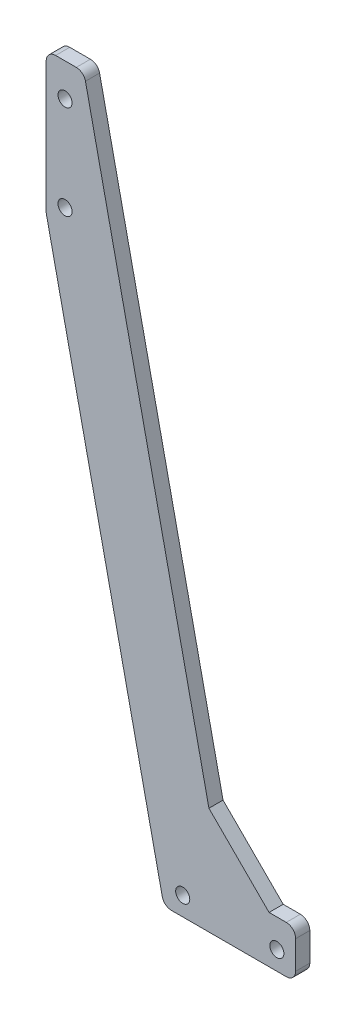
ISO-10303-21;
HEADER;
FILE_DESCRIPTION(('STEP AP214'),'2;1');
FILE_NAME('part.step','',(''),(''),'','','');
FILE_SCHEMA(('AUTOMOTIVE_DESIGN { 1 0 10303 214 1 1 1 1 }'));
ENDSEC;
DATA;
#1=APPLICATION_CONTEXT('core data for automotive mechanical design processes');
#2=APPLICATION_PROTOCOL_DEFINITION('international standard','automotive_design',2000,#1);
#3=PRODUCT_CONTEXT('',#1,'mechanical');
#4=PRODUCT('Part','Part','',(#3));
#5=PRODUCT_RELATED_PRODUCT_CATEGORY('part','',(#4));
#6=PRODUCT_DEFINITION_FORMATION('','',#4);
#7=PRODUCT_DEFINITION_CONTEXT('part definition',#1,'design');
#8=PRODUCT_DEFINITION('design','',#6,#7);
#9=PRODUCT_DEFINITION_SHAPE('','',#8);
#10=(LENGTH_UNIT() NAMED_UNIT(*) SI_UNIT(.MILLI.,.METRE.));
#11=(NAMED_UNIT(*) PLANE_ANGLE_UNIT() SI_UNIT($,.RADIAN.));
#12=(NAMED_UNIT(*) SI_UNIT($,.STERADIAN.) SOLID_ANGLE_UNIT());
#13=UNCERTAINTY_MEASURE_WITH_UNIT(LENGTH_MEASURE(1.E-05),#10,'distance_accuracy_value','');
#14=(GEOMETRIC_REPRESENTATION_CONTEXT(3) GLOBAL_UNCERTAINTY_ASSIGNED_CONTEXT((#13)) GLOBAL_UNIT_ASSIGNED_CONTEXT((#10,
#11,#12)) REPRESENTATION_CONTEXT('',''));
#15=CARTESIAN_POINT('',(0.,0.,0.));
#16=DIRECTION('',(0.,0.,1.));
#17=DIRECTION('',(1.,0.,0.));
#18=AXIS2_PLACEMENT_3D('',#15,#16,#17);
#19=CARTESIAN_POINT('',(0.,0.,3.));
#20=DIRECTION('',(0.,0.,1.));
#21=DIRECTION('',(1.,0.,0.));
#22=AXIS2_PLACEMENT_3D('',#19,#20,#21);
#23=PLANE('',#22);
#24=CARTESIAN_POINT('',(49.,4.,3.));
#25=DIRECTION('',(0.,0.,1.));
#26=DIRECTION('',(1.,0.,0.));
#27=AXIS2_PLACEMENT_3D('',#24,#25,#26);
#28=CIRCLE('',#27,1.5);
#29=CARTESIAN_POINT('',(50.5,4.,3.));
#30=VERTEX_POINT('',#29);
#31=EDGE_CURVE('E328',#30,#30,#28,.T.);
#32=ORIENTED_EDGE('',*,*,#31,.F.);
#33=EDGE_LOOP('',(#32));
#34=FACE_BOUND('',#33,.T.);
#35=CARTESIAN_POINT('',(4.,118.,3.));
#36=DIRECTION('',(0.,0.,1.));
#37=DIRECTION('',(1.,0.,0.));
#38=AXIS2_PLACEMENT_3D('',#35,#36,#37);
#39=CIRCLE('',#38,1.5);
#40=CARTESIAN_POINT('',(5.5,118.,3.));
#41=VERTEX_POINT('',#40);
#42=EDGE_CURVE('E270',#41,#41,#39,.T.);
#43=ORIENTED_EDGE('',*,*,#42,.F.);
#44=EDGE_LOOP('',(#43));
#45=FACE_BOUND('',#44,.T.);
#46=DIRECTION('',(0.,-1.,0.));
#47=VECTOR('',#46,1.);
#48=CARTESIAN_POINT('',(0.,145.,3.));
#49=LINE('',#48,#47);
#50=CARTESIAN_POINT('',(0.,143.,3.));
#51=VERTEX_POINT('',#50);
#52=CARTESIAN_POINT('',(0.,115.214881836752,3.));
#53=VERTEX_POINT('',#52);
#54=EDGE_CURVE('E178',#51,#53,#49,.T.);
#55=ORIENTED_EDGE('',*,*,#54,.T.);
#56=CARTESIAN_POINT('',(2.,115.214881836752,3.));
#57=DIRECTION('',(0.,0.,1.));
#58=DIRECTION('',(1.,0.,0.));
#59=AXIS2_PLACEMENT_3D('',#56,#57,#58);
#60=CIRCLE('',#59,2.);
#61=CARTESIAN_POINT('',(0.0456472721544016,114.79002254809,3.));
#62=VERTEX_POINT('',#61);
#63=EDGE_CURVE('E233',#53,#62,#60,.T.);
#64=ORIENTED_EDGE('',*,*,#63,.T.);
#65=DIRECTION('',(0.212429644331044,-0.977176363922801,0.));
#66=VECTOR('',#65,1.);
#67=CARTESIAN_POINT('',(0.,115.,3.));
#68=LINE('',#67,#66);
#69=CARTESIAN_POINT('',(24.6575781062309,1.57514071133794,3.));
#70=VERTEX_POINT('',#69);
#71=EDGE_CURVE('E313',#62,#70,#68,.T.);
#72=ORIENTED_EDGE('',*,*,#71,.T.);
#73=CARTESIAN_POINT('',(26.6119308340765,2.,3.));
#74=DIRECTION('',(0.,0.,1.));
#75=DIRECTION('',(1.,0.,0.));
#76=AXIS2_PLACEMENT_3D('',#73,#74,#75);
#77=CIRCLE('',#76,2.);
#78=CARTESIAN_POINT('',(26.6119308340765,0.,3.));
#79=VERTEX_POINT('',#78);
#80=EDGE_CURVE('E230',#70,#79,#77,.T.);
#81=ORIENTED_EDGE('',*,*,#80,.T.);
#82=DIRECTION('',(1.,0.,0.));
#83=VECTOR('',#82,1.);
#84=CARTESIAN_POINT('',(25.,0.,3.));
#85=LINE('',#84,#83);
#86=CARTESIAN_POINT('',(51.,0.,3.));
#87=VERTEX_POINT('',#86);
#88=EDGE_CURVE('E307',#79,#87,#85,.T.);
#89=ORIENTED_EDGE('',*,*,#88,.T.);
#90=CARTESIAN_POINT('',(51.,2.,3.));
#91=DIRECTION('',(0.,0.,1.));
#92=DIRECTION('',(1.,0.,0.));
#93=AXIS2_PLACEMENT_3D('',#90,#91,#92);
#94=CIRCLE('',#93,2.);
#95=CARTESIAN_POINT('',(53.,2.,3.));
#96=VERTEX_POINT('',#95);
#97=EDGE_CURVE('E227',#87,#96,#94,.T.);
#98=ORIENTED_EDGE('',*,*,#97,.T.);
#99=DIRECTION('',(0.,1.,0.));
#100=VECTOR('',#99,1.);
#101=CARTESIAN_POINT('',(53.,10.,3.));
#102=LINE('',#101,#100);
#103=CARTESIAN_POINT('',(53.,8.,3.));
#104=VERTEX_POINT('',#103);
#105=EDGE_CURVE('E304',#96,#104,#102,.T.);
#106=ORIENTED_EDGE('',*,*,#105,.T.);
#107=CARTESIAN_POINT('',(51.,8.,3.));
#108=DIRECTION('',(0.,0.,1.));
#109=DIRECTION('',(1.,0.,0.));
#110=AXIS2_PLACEMENT_3D('',#107,#108,#109);
#111=CIRCLE('',#110,2.);
#112=CARTESIAN_POINT('',(51.,10.,3.));
#113=VERTEX_POINT('',#112);
#114=EDGE_CURVE('E66',#104,#113,#111,.T.);
#115=ORIENTED_EDGE('',*,*,#114,.T.);
#116=DIRECTION('',(-1.,0.,0.));
#117=VECTOR('',#116,1.);
#118=CARTESIAN_POINT('',(37.3478260869565,10.,3.));
#119=LINE('',#118,#117);
#120=CARTESIAN_POINT('',(47.3478260869565,10.,3.));
#121=VERTEX_POINT('',#120);
#122=EDGE_CURVE('E302',#113,#121,#119,.T.);
#123=ORIENTED_EDGE('',*,*,#122,.T.);
#124=DIRECTION('',(0.707106781186544,-0.707106781186551,0.));
#125=VECTOR('',#124,1.);
#126=CARTESIAN_POINT('',(34.5700483091787,22.7777777777779,3.));
#127=LINE('',#126,#125);
#128=CARTESIAN_POINT('',(34.5700483091787,22.7777777777779,3.));
#129=VERTEX_POINT('',#128);
#130=EDGE_CURVE('E159',#121,#129,#127,.F.);
#131=ORIENTED_EDGE('',*,*,#130,.T.);
#132=DIRECTION('',(-0.212429644331044,0.977176363922801,0.));
#133=VECTOR('',#132,1.);
#134=CARTESIAN_POINT('',(8.,145.,3.));
#135=LINE('',#134,#133);
#136=CARTESIAN_POINT('',(8.34242189376911,143.424859288662,3.));
#137=VERTEX_POINT('',#136);
#138=EDGE_CURVE('E163',#129,#137,#135,.T.);
#139=ORIENTED_EDGE('',*,*,#138,.T.);
#140=CARTESIAN_POINT('',(6.38806916592351,143.,3.));
#141=DIRECTION('',(0.,0.,1.));
#142=DIRECTION('',(1.,0.,0.));
#143=AXIS2_PLACEMENT_3D('',#140,#141,#142);
#144=CIRCLE('',#143,2.);
#145=CARTESIAN_POINT('',(6.38806916592351,145.,3.));
#146=VERTEX_POINT('',#145);
#147=EDGE_CURVE('E222',#137,#146,#144,.T.);
#148=ORIENTED_EDGE('',*,*,#147,.T.);
#149=DIRECTION('',(-1.,0.,0.));
#150=VECTOR('',#149,1.);
#151=CARTESIAN_POINT('',(8.,145.,3.));
#152=LINE('',#151,#150);
#153=CARTESIAN_POINT('',(2.,145.,3.));
#154=VERTEX_POINT('',#153);
#155=EDGE_CURVE('E172',#146,#154,#152,.T.);
#156=ORIENTED_EDGE('',*,*,#155,.T.);
#157=CARTESIAN_POINT('',(2.,143.,3.));
#158=DIRECTION('',(0.,0.,1.));
#159=DIRECTION('',(1.,0.,0.));
#160=AXIS2_PLACEMENT_3D('',#157,#158,#159);
#161=CIRCLE('',#160,2.);
#162=EDGE_CURVE('E219',#154,#51,#161,.T.);
#163=ORIENTED_EDGE('',*,*,#162,.T.);
#164=EDGE_LOOP('',(#55,#64,#72,#81,#89,#98,#106,#115,#123,#131,#139,#148,#156,#163));
#165=FACE_BOUND('',#164,.T.);
#166=CARTESIAN_POINT('',(4.,138.,3.));
#167=DIRECTION('',(0.,0.,1.));
#168=DIRECTION('',(1.,0.,0.));
#169=AXIS2_PLACEMENT_3D('',#166,#167,#168);
#170=CIRCLE('',#169,1.5);
#171=CARTESIAN_POINT('',(5.5,138.,3.));
#172=VERTEX_POINT('',#171);
#173=EDGE_CURVE('E322',#172,#172,#170,.T.);
#174=ORIENTED_EDGE('',*,*,#173,.F.);
#175=EDGE_LOOP('',(#174));
#176=FACE_BOUND('',#175,.T.);
#177=CARTESIAN_POINT('',(29.,4.,3.));
#178=DIRECTION('',(0.,0.,1.));
#179=DIRECTION('',(1.,0.,0.));
#180=AXIS2_PLACEMENT_3D('',#177,#178,#179);
#181=CIRCLE('',#180,1.50000000000001);
#182=CARTESIAN_POINT('',(30.5,4.,3.));
#183=VERTEX_POINT('',#182);
#184=EDGE_CURVE('E336',#183,#183,#181,.T.);
#185=ORIENTED_EDGE('',*,*,#184,.F.);
#186=EDGE_LOOP('',(#185));
#187=FACE_BOUND('',#186,.T.);
#188=ADVANCED_FACE('F44',(#34,#45,#165,#176,#187),#23,.T.);
#189=CARTESIAN_POINT('',(0.,0.,0.));
#190=DIRECTION('',(0.,0.,1.));
#191=DIRECTION('',(1.,0.,0.));
#192=AXIS2_PLACEMENT_3D('',#189,#190,#191);
#193=PLANE('',#192);
#194=DIRECTION('',(0.212429644331044,-0.977176363922801,0.));
#195=VECTOR('',#194,1.);
#196=CARTESIAN_POINT('',(0.,115.,0.));
#197=LINE('',#196,#195);
#198=CARTESIAN_POINT('',(0.0456472721544016,114.79002254809,0.));
#199=VERTEX_POINT('',#198);
#200=CARTESIAN_POINT('',(24.6575781062309,1.57514071133794,0.));
#201=VERTEX_POINT('',#200);
#202=EDGE_CURVE('E275',#199,#201,#197,.T.);
#203=ORIENTED_EDGE('',*,*,#202,.F.);
#204=CARTESIAN_POINT('',(2.,115.214881836752,0.));
#205=DIRECTION('',(0.,0.,1.));
#206=DIRECTION('',(1.,0.,0.));
#207=AXIS2_PLACEMENT_3D('',#204,#205,#206);
#208=CIRCLE('',#207,2.);
#209=CARTESIAN_POINT('',(0.,115.214881836752,0.));
#210=VERTEX_POINT('',#209);
#211=EDGE_CURVE('E209',#199,#210,#208,.F.);
#212=ORIENTED_EDGE('',*,*,#211,.T.);
#213=DIRECTION('',(0.,-1.,0.));
#214=VECTOR('',#213,1.);
#215=CARTESIAN_POINT('',(0.,145.,0.));
#216=LINE('',#215,#214);
#217=CARTESIAN_POINT('',(0.,143.,0.));
#218=VERTEX_POINT('',#217);
#219=EDGE_CURVE('E269',#218,#210,#216,.T.);
#220=ORIENTED_EDGE('',*,*,#219,.F.);
#221=CARTESIAN_POINT('',(2.,143.,0.));
#222=DIRECTION('',(0.,0.,1.));
#223=DIRECTION('',(1.,0.,0.));
#224=AXIS2_PLACEMENT_3D('',#221,#222,#223);
#225=CIRCLE('',#224,2.);
#226=CARTESIAN_POINT('',(2.,145.,0.));
#227=VERTEX_POINT('',#226);
#228=EDGE_CURVE('E195',#218,#227,#225,.F.);
#229=ORIENTED_EDGE('',*,*,#228,.T.);
#230=DIRECTION('',(-1.,0.,0.));
#231=VECTOR('',#230,1.);
#232=CARTESIAN_POINT('',(8.,145.,0.));
#233=LINE('',#232,#231);
#234=CARTESIAN_POINT('',(6.38806916592351,145.,0.));
#235=VERTEX_POINT('',#234);
#236=EDGE_CURVE('E263',#235,#227,#233,.T.);
#237=ORIENTED_EDGE('',*,*,#236,.F.);
#238=CARTESIAN_POINT('',(6.38806916592351,143.,0.));
#239=DIRECTION('',(0.,0.,1.));
#240=DIRECTION('',(1.,0.,0.));
#241=AXIS2_PLACEMENT_3D('',#238,#239,#240);
#242=CIRCLE('',#241,2.);
#243=CARTESIAN_POINT('',(8.34242189376911,143.424859288662,0.));
#244=VERTEX_POINT('',#243);
#245=EDGE_CURVE('E170',#235,#244,#242,.F.);
#246=ORIENTED_EDGE('',*,*,#245,.T.);
#247=DIRECTION('',(-0.212429644331044,0.977176363922801,0.));
#248=VECTOR('',#247,1.);
#249=CARTESIAN_POINT('',(8.,145.,0.));
#250=LINE('',#249,#248);
#251=CARTESIAN_POINT('',(34.5700483091787,22.7777777777779,0.));
#252=VERTEX_POINT('',#251);
#253=EDGE_CURVE('E162',#252,#244,#250,.T.);
#254=ORIENTED_EDGE('',*,*,#253,.F.);
#255=DIRECTION('',(-0.707106781186544,0.707106781186551,0.));
#256=VECTOR('',#255,1.);
#257=CARTESIAN_POINT('',(28.6739130434785,28.6739130434782,0.));
#258=LINE('',#257,#256);
#259=CARTESIAN_POINT('',(47.3478260869565,10.,0.));
#260=VERTEX_POINT('',#259);
#261=EDGE_CURVE('E148',#252,#260,#258,.F.);
#262=ORIENTED_EDGE('',*,*,#261,.T.);
#263=DIRECTION('',(-1.,0.,0.));
#264=VECTOR('',#263,1.);
#265=CARTESIAN_POINT('',(37.3478260869565,10.,0.));
#266=LINE('',#265,#264);
#267=CARTESIAN_POINT('',(51.,10.,0.));
#268=VERTEX_POINT('',#267);
#269=EDGE_CURVE('E173',#268,#260,#266,.T.);
#270=ORIENTED_EDGE('',*,*,#269,.F.);
#271=CARTESIAN_POINT('',(51.,8.,0.));
#272=DIRECTION('',(0.,0.,1.));
#273=DIRECTION('',(1.,0.,0.));
#274=AXIS2_PLACEMENT_3D('',#271,#272,#273);
#275=CIRCLE('',#274,2.);
#276=CARTESIAN_POINT('',(53.,8.,0.));
#277=VERTEX_POINT('',#276);
#278=EDGE_CURVE('E200',#268,#277,#275,.F.);
#279=ORIENTED_EDGE('',*,*,#278,.T.);
#280=DIRECTION('',(0.,1.,0.));
#281=VECTOR('',#280,1.);
#282=CARTESIAN_POINT('',(53.,10.,0.));
#283=LINE('',#282,#281);
#284=CARTESIAN_POINT('',(53.,2.,0.));
#285=VERTEX_POINT('',#284);
#286=EDGE_CURVE('E180',#285,#277,#283,.T.);
#287=ORIENTED_EDGE('',*,*,#286,.F.);
#288=CARTESIAN_POINT('',(51.,2.,0.));
#289=DIRECTION('',(0.,0.,1.));
#290=DIRECTION('',(1.,0.,0.));
#291=AXIS2_PLACEMENT_3D('',#288,#289,#290);
#292=CIRCLE('',#291,2.);
#293=CARTESIAN_POINT('',(51.,0.,0.));
#294=VERTEX_POINT('',#293);
#295=EDGE_CURVE('E203',#285,#294,#292,.F.);
#296=ORIENTED_EDGE('',*,*,#295,.T.);
#297=DIRECTION('',(1.,0.,0.));
#298=VECTOR('',#297,1.);
#299=CARTESIAN_POINT('',(25.,0.,0.));
#300=LINE('',#299,#298);
#301=CARTESIAN_POINT('',(26.6119308340765,0.,0.));
#302=VERTEX_POINT('',#301);
#303=EDGE_CURVE('E286',#302,#294,#300,.T.);
#304=ORIENTED_EDGE('',*,*,#303,.F.);
#305=CARTESIAN_POINT('',(26.6119308340765,2.,0.));
#306=DIRECTION('',(0.,0.,1.));
#307=DIRECTION('',(1.,0.,0.));
#308=AXIS2_PLACEMENT_3D('',#305,#306,#307);
#309=CIRCLE('',#308,2.);
#310=EDGE_CURVE('E206',#302,#201,#309,.F.);
#311=ORIENTED_EDGE('',*,*,#310,.T.);
#312=EDGE_LOOP('',(#203,#212,#220,#229,#237,#246,#254,#262,#270,#279,#287,#296,#304,#311));
#313=FACE_BOUND('',#312,.T.);
#314=CARTESIAN_POINT('',(4.,118.,0.));
#315=DIRECTION('',(0.,0.,1.));
#316=DIRECTION('',(1.,0.,0.));
#317=AXIS2_PLACEMENT_3D('',#314,#315,#316);
#318=CIRCLE('',#317,1.5);
#319=CARTESIAN_POINT('',(5.5,118.,0.));
#320=VERTEX_POINT('',#319);
#321=EDGE_CURVE('E278',#320,#320,#318,.T.);
#322=ORIENTED_EDGE('',*,*,#321,.T.);
#323=EDGE_LOOP('',(#322));
#324=FACE_BOUND('',#323,.T.);
#325=CARTESIAN_POINT('',(4.,138.,0.));
#326=DIRECTION('',(0.,0.,1.));
#327=DIRECTION('',(1.,0.,0.));
#328=AXIS2_PLACEMENT_3D('',#325,#326,#327);
#329=CIRCLE('',#328,1.5);
#330=CARTESIAN_POINT('',(5.5,138.,0.));
#331=VERTEX_POINT('',#330);
#332=EDGE_CURVE('E324',#331,#331,#329,.T.);
#333=ORIENTED_EDGE('',*,*,#332,.T.);
#334=EDGE_LOOP('',(#333));
#335=FACE_BOUND('',#334,.T.);
#336=CARTESIAN_POINT('',(49.,4.,0.));
#337=DIRECTION('',(0.,0.,1.));
#338=DIRECTION('',(1.,0.,0.));
#339=AXIS2_PLACEMENT_3D('',#336,#337,#338);
#340=CIRCLE('',#339,1.5);
#341=CARTESIAN_POINT('',(50.5,4.,0.));
#342=VERTEX_POINT('',#341);
#343=EDGE_CURVE('E332',#342,#342,#340,.T.);
#344=ORIENTED_EDGE('',*,*,#343,.T.);
#345=EDGE_LOOP('',(#344));
#346=FACE_BOUND('',#345,.T.);
#347=CARTESIAN_POINT('',(29.,4.,0.));
#348=DIRECTION('',(0.,0.,1.));
#349=DIRECTION('',(1.,0.,0.));
#350=AXIS2_PLACEMENT_3D('',#347,#348,#349);
#351=CIRCLE('',#350,1.50000000000001);
#352=CARTESIAN_POINT('',(30.5,4.,0.));
#353=VERTEX_POINT('',#352);
#354=EDGE_CURVE('E340',#353,#353,#351,.T.);
#355=ORIENTED_EDGE('',*,*,#354,.T.);
#356=EDGE_LOOP('',(#355));
#357=FACE_BOUND('',#356,.T.);
#358=ADVANCED_FACE('F167',(#313,#324,#335,#346,#357),#193,.F.);
#359=CARTESIAN_POINT('',(8.,145.,3.));
#360=DIRECTION('',(0.,-1.,0.));
#361=DIRECTION('',(0.,0.,-1.));
#362=AXIS2_PLACEMENT_3D('',#359,#360,#361);
#363=PLANE('',#362);
#364=ORIENTED_EDGE('',*,*,#155,.F.);
#365=DIRECTION('',(0.,0.,-1.));
#366=VECTOR('',#365,1.);
#367=CARTESIAN_POINT('',(6.38806916592351,145.,3.));
#368=LINE('',#367,#366);
#369=EDGE_CURVE('E53',#146,#235,#368,.T.);
#370=ORIENTED_EDGE('',*,*,#369,.T.);
#371=ORIENTED_EDGE('',*,*,#236,.T.);
#372=DIRECTION('',(0.,0.,-1.));
#373=VECTOR('',#372,1.);
#374=CARTESIAN_POINT('',(2.,145.,3.));
#375=LINE('',#374,#373);
#376=EDGE_CURVE('E254',#227,#154,#375,.F.);
#377=ORIENTED_EDGE('',*,*,#376,.T.);
#378=EDGE_LOOP('',(#364,#370,#371,#377));
#379=FACE_BOUND('',#378,.T.);
#380=ADVANCED_FACE('F262',(#379),#363,.F.);
#381=CARTESIAN_POINT('',(0.,145.,3.));
#382=DIRECTION('',(1.,0.,0.));
#383=DIRECTION('',(0.,1.,0.));
#384=AXIS2_PLACEMENT_3D('',#381,#382,#383);
#385=PLANE('',#384);
#386=ORIENTED_EDGE('',*,*,#219,.T.);
#387=DIRECTION('',(0.,0.,-1.));
#388=VECTOR('',#387,1.);
#389=CARTESIAN_POINT('',(0.,115.214881836752,3.));
#390=LINE('',#389,#388);
#391=EDGE_CURVE('E216',#210,#53,#390,.F.);
#392=ORIENTED_EDGE('',*,*,#391,.T.);
#393=ORIENTED_EDGE('',*,*,#54,.F.);
#394=DIRECTION('',(0.,0.,-1.));
#395=VECTOR('',#394,1.);
#396=CARTESIAN_POINT('',(0.,143.,3.));
#397=LINE('',#396,#395);
#398=EDGE_CURVE('E212',#51,#218,#397,.T.);
#399=ORIENTED_EDGE('',*,*,#398,.T.);
#400=EDGE_LOOP('',(#386,#392,#393,#399));
#401=FACE_BOUND('',#400,.T.);
#402=ADVANCED_FACE('F378',(#401),#385,.F.);
#403=CARTESIAN_POINT('',(0.,115.,3.));
#404=DIRECTION('',(0.977176363922801,0.212429644331044,0.));
#405=DIRECTION('',(-0.212429644331044,0.977176363922801,0.));
#406=AXIS2_PLACEMENT_3D('',#403,#404,#405);
#407=PLANE('',#406);
#408=ORIENTED_EDGE('',*,*,#71,.F.);
#409=DIRECTION('',(0.,0.,-1.));
#410=VECTOR('',#409,1.);
#411=CARTESIAN_POINT('',(0.0456472721544015,114.79002254809,3.));
#412=LINE('',#411,#410);
#413=EDGE_CURVE('E191',#62,#199,#412,.T.);
#414=ORIENTED_EDGE('',*,*,#413,.T.);
#415=ORIENTED_EDGE('',*,*,#202,.T.);
#416=DIRECTION('',(0.,0.,-1.));
#417=VECTOR('',#416,1.);
#418=CARTESIAN_POINT('',(24.6575781062309,1.57514071133791,3.));
#419=LINE('',#418,#417);
#420=EDGE_CURVE('E188',#201,#70,#419,.F.);
#421=ORIENTED_EDGE('',*,*,#420,.T.);
#422=EDGE_LOOP('',(#408,#414,#415,#421));
#423=FACE_BOUND('',#422,.T.);
#424=ADVANCED_FACE('F374',(#423),#407,.F.);
#425=CARTESIAN_POINT('',(25.,0.,3.));
#426=DIRECTION('',(0.,1.,0.));
#427=DIRECTION('',(0.,0.,1.));
#428=AXIS2_PLACEMENT_3D('',#425,#426,#427);
#429=PLANE('',#428);
#430=ORIENTED_EDGE('',*,*,#88,.F.);
#431=DIRECTION('',(0.,0.,-1.));
#432=VECTOR('',#431,1.);
#433=CARTESIAN_POINT('',(26.6119308340765,0.,3.));
#434=LINE('',#433,#432);
#435=EDGE_CURVE('E239',#79,#302,#434,.T.);
#436=ORIENTED_EDGE('',*,*,#435,.T.);
#437=ORIENTED_EDGE('',*,*,#303,.T.);
#438=DIRECTION('',(0.,0.,-1.));
#439=VECTOR('',#438,1.);
#440=CARTESIAN_POINT('',(51.,0.,3.));
#441=LINE('',#440,#439);
#442=EDGE_CURVE('E236',#294,#87,#441,.F.);
#443=ORIENTED_EDGE('',*,*,#442,.T.);
#444=EDGE_LOOP('',(#430,#436,#437,#443));
#445=FACE_BOUND('',#444,.T.);
#446=ADVANCED_FACE('F371',(#445),#429,.F.);
#447=CARTESIAN_POINT('',(53.,10.,3.));
#448=DIRECTION('',(-1.,0.,0.));
#449=DIRECTION('',(0.,0.,1.));
#450=AXIS2_PLACEMENT_3D('',#447,#448,#449);
#451=PLANE('',#450);
#452=ORIENTED_EDGE('',*,*,#105,.F.);
#453=DIRECTION('',(0.,0.,-1.));
#454=VECTOR('',#453,1.);
#455=CARTESIAN_POINT('',(53.,2.,3.));
#456=LINE('',#455,#454);
#457=EDGE_CURVE('E246',#96,#285,#456,.T.);
#458=ORIENTED_EDGE('',*,*,#457,.T.);
#459=ORIENTED_EDGE('',*,*,#286,.T.);
#460=DIRECTION('',(0.,0.,-1.));
#461=VECTOR('',#460,1.);
#462=CARTESIAN_POINT('',(53.,8.,3.));
#463=LINE('',#462,#461);
#464=EDGE_CURVE('E243',#277,#104,#463,.F.);
#465=ORIENTED_EDGE('',*,*,#464,.T.);
#466=EDGE_LOOP('',(#452,#458,#459,#465));
#467=FACE_BOUND('',#466,.T.);
#468=ADVANCED_FACE('F295',(#467),#451,.F.);
#469=CARTESIAN_POINT('',(37.3478260869565,10.,3.));
#470=DIRECTION('',(0.,-1.,0.));
#471=DIRECTION('',(0.,0.,-1.));
#472=AXIS2_PLACEMENT_3D('',#469,#470,#471);
#473=PLANE('',#472);
#474=ORIENTED_EDGE('',*,*,#122,.F.);
#475=DIRECTION('',(0.,0.,-1.));
#476=VECTOR('',#475,1.);
#477=CARTESIAN_POINT('',(51.,10.,3.));
#478=LINE('',#477,#476);
#479=EDGE_CURVE('E250',#113,#268,#478,.T.);
#480=ORIENTED_EDGE('',*,*,#479,.T.);
#481=ORIENTED_EDGE('',*,*,#269,.T.);
#482=DIRECTION('',(0.,0.,1.));
#483=VECTOR('',#482,1.);
#484=CARTESIAN_POINT('',(47.3478260869565,10.,3.));
#485=LINE('',#484,#483);
#486=EDGE_CURVE('E154',#260,#121,#485,.T.);
#487=ORIENTED_EDGE('',*,*,#486,.T.);
#488=EDGE_LOOP('',(#474,#480,#481,#487));
#489=FACE_BOUND('',#488,.T.);
#490=ADVANCED_FACE('F301',(#489),#473,.F.);
#491=CARTESIAN_POINT('',(8.,145.,3.));
#492=DIRECTION('',(-0.977176363922801,-0.212429644331044,0.));
#493=DIRECTION('',(0.212429644331044,-0.977176363922801,0.));
#494=AXIS2_PLACEMENT_3D('',#491,#492,#493);
#495=PLANE('',#494);
#496=ORIENTED_EDGE('',*,*,#253,.T.);
#497=DIRECTION('',(0.,0.,-1.));
#498=VECTOR('',#497,1.);
#499=CARTESIAN_POINT('',(8.34242189376911,143.424859288662,3.));
#500=LINE('',#499,#498);
#501=EDGE_CURVE('E11',#244,#137,#500,.F.);
#502=ORIENTED_EDGE('',*,*,#501,.T.);
#503=ORIENTED_EDGE('',*,*,#138,.F.);
#504=DIRECTION('',(0.,0.,-1.));
#505=VECTOR('',#504,1.);
#506=CARTESIAN_POINT('',(34.5700483091787,22.7777777777779,0.));
#507=LINE('',#506,#505);
#508=EDGE_CURVE('E152',#129,#252,#507,.T.);
#509=ORIENTED_EDGE('',*,*,#508,.T.);
#510=EDGE_LOOP('',(#496,#502,#503,#509));
#511=FACE_BOUND('',#510,.T.);
#512=ADVANCED_FACE('F161',(#511),#495,.F.);
#513=CARTESIAN_POINT('',(4.,118.,3.));
#514=DIRECTION('',(0.,0.,-1.));
#515=DIRECTION('',(-1.,0.,0.));
#516=AXIS2_PLACEMENT_3D('',#513,#514,#515);
#517=CYLINDRICAL_SURFACE('',#516,1.5);
#518=ORIENTED_EDGE('',*,*,#42,.T.);
#519=EDGE_LOOP('',(#518));
#520=FACE_BOUND('',#519,.T.);
#521=ORIENTED_EDGE('',*,*,#321,.F.);
#522=EDGE_LOOP('',(#521));
#523=FACE_BOUND('',#522,.T.);
#524=ADVANCED_FACE('F362',(#520,#523),#517,.F.);
#525=CARTESIAN_POINT('',(4.,138.,3.));
#526=DIRECTION('',(0.,0.,-1.));
#527=DIRECTION('',(-1.,0.,0.));
#528=AXIS2_PLACEMENT_3D('',#525,#526,#527);
#529=CYLINDRICAL_SURFACE('',#528,1.5);
#530=ORIENTED_EDGE('',*,*,#173,.T.);
#531=EDGE_LOOP('',(#530));
#532=FACE_BOUND('',#531,.T.);
#533=ORIENTED_EDGE('',*,*,#332,.F.);
#534=EDGE_LOOP('',(#533));
#535=FACE_BOUND('',#534,.T.);
#536=ADVANCED_FACE('F426',(#532,#535),#529,.F.);
#537=CARTESIAN_POINT('',(49.,4.,3.));
#538=DIRECTION('',(0.,0.,-1.));
#539=DIRECTION('',(-1.,0.,0.));
#540=AXIS2_PLACEMENT_3D('',#537,#538,#539);
#541=CYLINDRICAL_SURFACE('',#540,1.5);
#542=ORIENTED_EDGE('',*,*,#31,.T.);
#543=EDGE_LOOP('',(#542));
#544=FACE_BOUND('',#543,.T.);
#545=ORIENTED_EDGE('',*,*,#343,.F.);
#546=EDGE_LOOP('',(#545));
#547=FACE_BOUND('',#546,.T.);
#548=ADVANCED_FACE('F429',(#544,#547),#541,.F.);
#549=CARTESIAN_POINT('',(29.,4.,3.));
#550=DIRECTION('',(0.,0.,-1.));
#551=DIRECTION('',(-1.,0.,0.));
#552=AXIS2_PLACEMENT_3D('',#549,#550,#551);
#553=CYLINDRICAL_SURFACE('',#552,1.50000000000001);
#554=ORIENTED_EDGE('',*,*,#184,.T.);
#555=EDGE_LOOP('',(#554));
#556=FACE_BOUND('',#555,.T.);
#557=ORIENTED_EDGE('',*,*,#354,.F.);
#558=EDGE_LOOP('',(#557));
#559=FACE_BOUND('',#558,.T.);
#560=ADVANCED_FACE('F348',(#556,#559),#553,.F.);
#561=CARTESIAN_POINT('',(34.5700483091787,22.7777777777779,3.));
#562=DIRECTION('',(0.707106781186551,0.707106781186544,0.));
#563=DIRECTION('',(0.,0.,1.));
#564=AXIS2_PLACEMENT_3D('',#561,#562,#563);
#565=PLANE('',#564);
#566=ORIENTED_EDGE('',*,*,#130,.F.);
#567=ORIENTED_EDGE('',*,*,#486,.F.);
#568=ORIENTED_EDGE('',*,*,#261,.F.);
#569=ORIENTED_EDGE('',*,*,#508,.F.);
#570=EDGE_LOOP('',(#566,#567,#568,#569));
#571=FACE_BOUND('',#570,.T.);
#572=ADVANCED_FACE('F151',(#571),#565,.T.);
#573=CARTESIAN_POINT('',(2.,115.214881836752,3.));
#574=DIRECTION('',(0.,0.,-1.));
#575=DIRECTION('',(-1.,0.,0.));
#576=AXIS2_PLACEMENT_3D('',#573,#574,#575);
#577=CYLINDRICAL_SURFACE('',#576,2.);
#578=ORIENTED_EDGE('',*,*,#63,.F.);
#579=ORIENTED_EDGE('',*,*,#391,.F.);
#580=ORIENTED_EDGE('',*,*,#211,.F.);
#581=ORIENTED_EDGE('',*,*,#413,.F.);
#582=EDGE_LOOP('',(#578,#579,#580,#581));
#583=FACE_BOUND('',#582,.T.);
#584=ADVANCED_FACE('F390',(#583),#577,.T.);
#585=CARTESIAN_POINT('',(26.6119308340765,2.,3.));
#586=DIRECTION('',(0.,0.,-1.));
#587=DIRECTION('',(-1.,0.,0.));
#588=AXIS2_PLACEMENT_3D('',#585,#586,#587);
#589=CYLINDRICAL_SURFACE('',#588,2.);
#590=ORIENTED_EDGE('',*,*,#80,.F.);
#591=ORIENTED_EDGE('',*,*,#420,.F.);
#592=ORIENTED_EDGE('',*,*,#310,.F.);
#593=ORIENTED_EDGE('',*,*,#435,.F.);
#594=EDGE_LOOP('',(#590,#591,#592,#593));
#595=FACE_BOUND('',#594,.T.);
#596=ADVANCED_FACE('F393',(#595),#589,.T.);
#597=CARTESIAN_POINT('',(51.,2.,3.));
#598=DIRECTION('',(0.,0.,-1.));
#599=DIRECTION('',(-1.,0.,0.));
#600=AXIS2_PLACEMENT_3D('',#597,#598,#599);
#601=CYLINDRICAL_SURFACE('',#600,2.);
#602=ORIENTED_EDGE('',*,*,#97,.F.);
#603=ORIENTED_EDGE('',*,*,#442,.F.);
#604=ORIENTED_EDGE('',*,*,#295,.F.);
#605=ORIENTED_EDGE('',*,*,#457,.F.);
#606=EDGE_LOOP('',(#602,#603,#604,#605));
#607=FACE_BOUND('',#606,.T.);
#608=ADVANCED_FACE('F397',(#607),#601,.T.);
#609=CARTESIAN_POINT('',(51.,8.,3.));
#610=DIRECTION('',(0.,0.,-1.));
#611=DIRECTION('',(-1.,0.,0.));
#612=AXIS2_PLACEMENT_3D('',#609,#610,#611);
#613=CYLINDRICAL_SURFACE('',#612,2.);
#614=ORIENTED_EDGE('',*,*,#114,.F.);
#615=ORIENTED_EDGE('',*,*,#464,.F.);
#616=ORIENTED_EDGE('',*,*,#278,.F.);
#617=ORIENTED_EDGE('',*,*,#479,.F.);
#618=EDGE_LOOP('',(#614,#615,#616,#617));
#619=FACE_BOUND('',#618,.T.);
#620=ADVANCED_FACE('F298',(#619),#613,.T.);
#621=CARTESIAN_POINT('',(6.38806916592351,143.,3.));
#622=DIRECTION('',(0.,0.,-1.));
#623=DIRECTION('',(-1.,0.,0.));
#624=AXIS2_PLACEMENT_3D('',#621,#622,#623);
#625=CYLINDRICAL_SURFACE('',#624,2.);
#626=ORIENTED_EDGE('',*,*,#147,.F.);
#627=ORIENTED_EDGE('',*,*,#501,.F.);
#628=ORIENTED_EDGE('',*,*,#245,.F.);
#629=ORIENTED_EDGE('',*,*,#369,.F.);
#630=EDGE_LOOP('',(#626,#627,#628,#629));
#631=FACE_BOUND('',#630,.T.);
#632=ADVANCED_FACE('F403',(#631),#625,.T.);
#633=CARTESIAN_POINT('',(2.,143.,3.));
#634=DIRECTION('',(0.,0.,-1.));
#635=DIRECTION('',(-1.,0.,0.));
#636=AXIS2_PLACEMENT_3D('',#633,#634,#635);
#637=CYLINDRICAL_SURFACE('',#636,2.);
#638=ORIENTED_EDGE('',*,*,#162,.F.);
#639=ORIENTED_EDGE('',*,*,#376,.F.);
#640=ORIENTED_EDGE('',*,*,#228,.F.);
#641=ORIENTED_EDGE('',*,*,#398,.F.);
#642=EDGE_LOOP('',(#638,#639,#640,#641));
#643=FACE_BOUND('',#642,.T.);
#644=ADVANCED_FACE('F46',(#643),#637,.T.);
#645=CLOSED_SHELL('',(#188,#358,#380,#402,#424,#446,#468,#490,#512,#524,#536,#548,#560,#572,
#584,#596,#608,#620,#632,#644));
#646=MANIFOLD_SOLID_BREP('B2',#645);
#647=ADVANCED_BREP_SHAPE_REPRESENTATION('',(#18,#646),#14);
#648=SHAPE_DEFINITION_REPRESENTATION(#9,#647);
ENDSEC;
END-ISO-10303-21;
